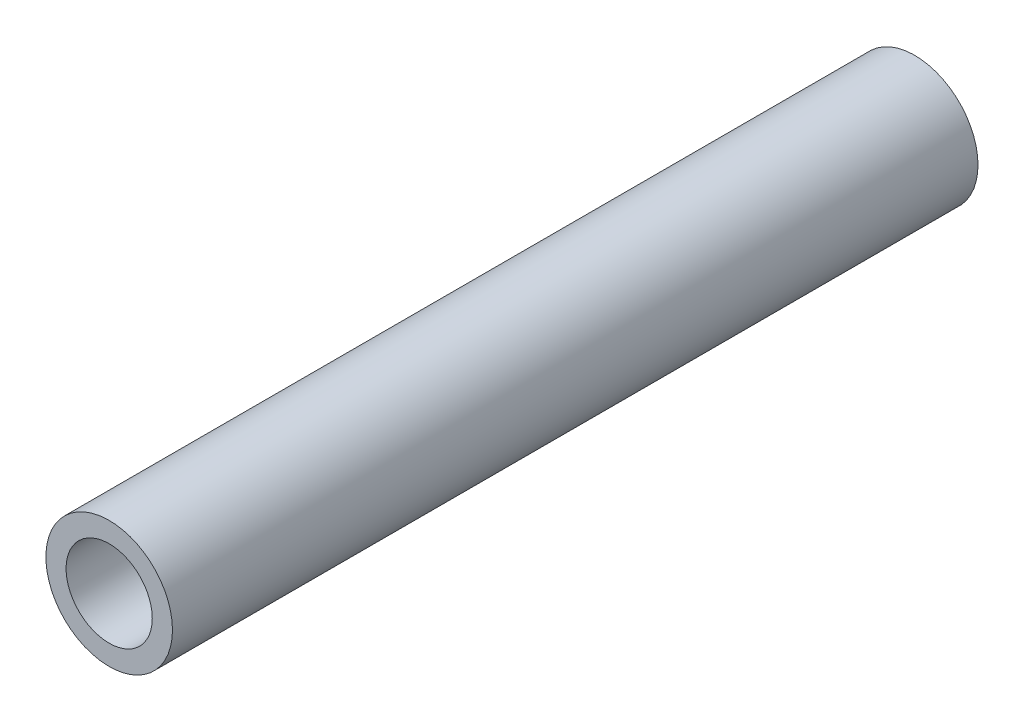
ISO-10303-21;
HEADER;
FILE_DESCRIPTION(('STEP AP214'),'2;1');
FILE_NAME('part.step','',(''),(''),'','','');
FILE_SCHEMA(('AUTOMOTIVE_DESIGN { 1 0 10303 214 1 1 1 1 }'));
ENDSEC;
DATA;
#1=APPLICATION_CONTEXT('core data for automotive mechanical design processes');
#2=APPLICATION_PROTOCOL_DEFINITION('international standard','automotive_design',2000,#1);
#3=PRODUCT_CONTEXT('',#1,'mechanical');
#4=PRODUCT('Part','Part','',(#3));
#5=PRODUCT_RELATED_PRODUCT_CATEGORY('part','',(#4));
#6=PRODUCT_DEFINITION_FORMATION('','',#4);
#7=PRODUCT_DEFINITION_CONTEXT('part definition',#1,'design');
#8=PRODUCT_DEFINITION('design','',#6,#7);
#9=PRODUCT_DEFINITION_SHAPE('','',#8);
#10=(LENGTH_UNIT() NAMED_UNIT(*) SI_UNIT(.MILLI.,.METRE.));
#11=(NAMED_UNIT(*) PLANE_ANGLE_UNIT() SI_UNIT($,.RADIAN.));
#12=(NAMED_UNIT(*) SI_UNIT($,.STERADIAN.) SOLID_ANGLE_UNIT());
#13=UNCERTAINTY_MEASURE_WITH_UNIT(LENGTH_MEASURE(1.E-05),#10,'distance_accuracy_value','');
#14=(GEOMETRIC_REPRESENTATION_CONTEXT(3) GLOBAL_UNCERTAINTY_ASSIGNED_CONTEXT((#13)) GLOBAL_UNIT_ASSIGNED_CONTEXT((#10,
#11,#12)) REPRESENTATION_CONTEXT('',''));
#15=CARTESIAN_POINT('',(0.,0.,0.));
#16=DIRECTION('',(0.,0.,1.));
#17=DIRECTION('',(1.,0.,0.));
#18=AXIS2_PLACEMENT_3D('',#15,#16,#17);
#19=CARTESIAN_POINT('',(164.150000000002,2168.81000620157,-40.));
#20=DIRECTION('',(0.,0.,1.));
#21=DIRECTION('',(1.,0.,0.));
#22=AXIS2_PLACEMENT_3D('',#19,#20,#21);
#23=CYLINDRICAL_SURFACE('',#22,10.9999999999994);
#24=CARTESIAN_POINT('',(164.150000000002,2168.81000620157,-40.));
#25=DIRECTION('',(0.,0.,1.));
#26=DIRECTION('',(1.,0.,0.));
#27=AXIS2_PLACEMENT_3D('',#24,#25,#26);
#28=CIRCLE('',#27,10.9999999999994);
#29=CARTESIAN_POINT('',(175.150000000001,2168.81000620157,-40.));
#30=VERTEX_POINT('',#29);
#31=EDGE_CURVE('E10',#30,#30,#28,.T.);
#32=CARTESIAN_POINT('',(164.150000000002,2168.81000620157,100.));
#33=DIRECTION('',(0.,0.,1.));
#34=DIRECTION('',(1.,0.,0.));
#35=AXIS2_PLACEMENT_3D('',#32,#33,#34);
#36=CIRCLE('',#35,10.9999999999994);
#37=CARTESIAN_POINT('',(175.150000000001,2168.81000620157,100.));
#38=VERTEX_POINT('',#37);
#39=EDGE_CURVE('E45',#38,#38,#36,.T.);
#40=CARTESIAN_POINT('',(175.150000000001,2168.81000620157,-40.));
#41=CARTESIAN_POINT('',(175.150000000001,2168.81000620157,-38.5416666666667));
#42=CARTESIAN_POINT('',(175.150000000001,2168.81000620157,-37.0833333333333));
#43=CARTESIAN_POINT('',(175.150000000001,2168.81000620157,-34.1666666666667));
#44=CARTESIAN_POINT('',(175.150000000001,2168.81000620157,-32.7083333333333));
#45=CARTESIAN_POINT('',(175.150000000001,2168.81000620157,-29.7916666666667));
#46=CARTESIAN_POINT('',(175.150000000001,2168.81000620157,-28.3333333333333));
#47=CARTESIAN_POINT('',(175.150000000001,2168.81000620157,-25.4166666666667));
#48=CARTESIAN_POINT('',(175.150000000001,2168.81000620157,-23.9583333333333));
#49=CARTESIAN_POINT('',(175.150000000001,2168.81000620157,-21.0416666666667));
#50=CARTESIAN_POINT('',(175.150000000001,2168.81000620157,-19.5833333333333));
#51=CARTESIAN_POINT('',(175.150000000001,2168.81000620157,-16.6666666666667));
#52=CARTESIAN_POINT('',(175.150000000001,2168.81000620157,-15.2083333333333));
#53=CARTESIAN_POINT('',(175.150000000001,2168.81000620157,-12.2916666666667));
#54=CARTESIAN_POINT('',(175.150000000001,2168.81000620157,-10.8333333333333));
#55=CARTESIAN_POINT('',(175.150000000001,2168.81000620157,-7.91666666666668));
#56=CARTESIAN_POINT('',(175.150000000001,2168.81000620157,-6.45833333333334));
#57=CARTESIAN_POINT('',(175.150000000001,2168.81000620157,-3.54166666666668));
#58=CARTESIAN_POINT('',(175.150000000001,2168.81000620157,-2.08333333333334));
#59=CARTESIAN_POINT('',(175.150000000001,2168.81000620157,0.833333333333327));
#60=CARTESIAN_POINT('',(175.150000000001,2168.81000620157,2.29166666666666));
#61=CARTESIAN_POINT('',(175.150000000001,2168.81000620157,5.20833333333333));
#62=CARTESIAN_POINT('',(175.150000000001,2168.81000620157,6.66666666666666));
#63=CARTESIAN_POINT('',(175.150000000001,2168.81000620157,9.58333333333333));
#64=CARTESIAN_POINT('',(175.150000000001,2168.81000620157,11.0416666666667));
#65=CARTESIAN_POINT('',(175.150000000001,2168.81000620157,13.9583333333333));
#66=CARTESIAN_POINT('',(175.150000000001,2168.81000620157,15.4166666666667));
#67=CARTESIAN_POINT('',(175.150000000001,2168.81000620157,18.3333333333333));
#68=CARTESIAN_POINT('',(175.150000000001,2168.81000620157,19.7916666666667));
#69=CARTESIAN_POINT('',(175.150000000001,2168.81000620157,22.7083333333333));
#70=CARTESIAN_POINT('',(175.150000000001,2168.81000620157,24.1666666666667));
#71=CARTESIAN_POINT('',(175.150000000001,2168.81000620157,27.0833333333333));
#72=CARTESIAN_POINT('',(175.150000000001,2168.81000620157,28.5416666666667));
#73=CARTESIAN_POINT('',(175.150000000001,2168.81000620157,31.4583333333333));
#74=CARTESIAN_POINT('',(175.150000000001,2168.81000620157,32.9166666666667));
#75=CARTESIAN_POINT('',(175.150000000001,2168.81000620157,35.8333333333333));
#76=CARTESIAN_POINT('',(175.150000000001,2168.81000620157,37.2916666666667));
#77=CARTESIAN_POINT('',(175.150000000001,2168.81000620157,40.2083333333333));
#78=CARTESIAN_POINT('',(175.150000000001,2168.81000620157,41.6666666666667));
#79=CARTESIAN_POINT('',(175.150000000001,2168.81000620157,44.5833333333333));
#80=CARTESIAN_POINT('',(175.150000000001,2168.81000620157,46.0416666666667));
#81=CARTESIAN_POINT('',(175.150000000001,2168.81000620157,48.9583333333334));
#82=CARTESIAN_POINT('',(175.150000000001,2168.81000620157,50.4166666666667));
#83=CARTESIAN_POINT('',(175.150000000001,2168.81000620157,53.3333333333333));
#84=CARTESIAN_POINT('',(175.150000000001,2168.81000620157,54.7916666666667));
#85=CARTESIAN_POINT('',(175.150000000001,2168.81000620157,57.7083333333333));
#86=CARTESIAN_POINT('',(175.150000000001,2168.81000620157,59.1666666666667));
#87=CARTESIAN_POINT('',(175.150000000001,2168.81000620157,62.0833333333334));
#88=CARTESIAN_POINT('',(175.150000000001,2168.81000620157,63.5416666666667));
#89=CARTESIAN_POINT('',(175.150000000001,2168.81000620157,66.4583333333334));
#90=CARTESIAN_POINT('',(175.150000000001,2168.81000620157,67.9166666666667));
#91=CARTESIAN_POINT('',(175.150000000001,2168.81000620157,70.8333333333334));
#92=CARTESIAN_POINT('',(175.150000000001,2168.81000620157,72.2916666666667));
#93=CARTESIAN_POINT('',(175.150000000001,2168.81000620157,75.2083333333334));
#94=CARTESIAN_POINT('',(175.150000000001,2168.81000620157,76.6666666666667));
#95=CARTESIAN_POINT('',(175.150000000001,2168.81000620157,79.5833333333334));
#96=CARTESIAN_POINT('',(175.150000000001,2168.81000620157,81.0416666666667));
#97=CARTESIAN_POINT('',(175.150000000001,2168.81000620157,83.9583333333334));
#98=CARTESIAN_POINT('',(175.150000000001,2168.81000620157,85.4166666666667));
#99=CARTESIAN_POINT('',(175.150000000001,2168.81000620157,88.3333333333334));
#100=CARTESIAN_POINT('',(175.150000000001,2168.81000620157,89.7916666666667));
#101=CARTESIAN_POINT('',(175.150000000001,2168.81000620157,92.7083333333334));
#102=CARTESIAN_POINT('',(175.150000000001,2168.81000620157,94.1666666666667));
#103=CARTESIAN_POINT('',(175.150000000001,2168.81000620157,97.0833333333334));
#104=CARTESIAN_POINT('',(175.150000000001,2168.81000620157,98.5416666666667));
#105=CARTESIAN_POINT('',(175.150000000001,2168.81000620157,100.));
#106=B_SPLINE_CURVE_WITH_KNOTS('',3,(#40,#41,#42,#43,#44,#45,#46,#47,#48,#49,#50,#51,#52,#53,
#54,#55,#56,#57,#58,#59,#60,#61,#62,#63,#64,#65,#66,#67,#68,#69,#70,#71,#72,#73,#74,#75,#76,#77,
#78,#79,#80,#81,#82,#83,#84,#85,#86,#87,#88,#89,#90,#91,#92,#93,#94,#95,#96,#97,#98,#99,#100,
#101,#102,#103,#104,#105),.UNSPECIFIED.,.F.,.F.,(4,2,2,2,2,2,2,2,2,2,2,2,2,2,2,2,2,2,2,2,2,2,2,
2,2,2,2,2,2,2,2,2,4),(0.,4.375,8.75000000000001,13.125,17.5,21.875,26.25,30.625,35.,39.375,
43.75,48.125,52.5,56.875,61.25,65.625,70.,74.375,78.75,83.125,87.5,91.875,96.25,100.625,105.,
109.375,113.75,118.125,122.5,126.875,131.25,135.625,140.),.UNSPECIFIED.);
#107=EDGE_CURVE('BSEAM35',#30,#38,#106,.T.);
#108=ORIENTED_EDGE('',*,*,#31,.T.);
#109=ORIENTED_EDGE('',*,*,#39,.F.);
#110=ORIENTED_EDGE('',*,*,#107,.T.);
#111=ORIENTED_EDGE('',*,*,#107,.F.);
#112=EDGE_LOOP('',(#108,#110,#109,#111));
#113=FACE_BOUND('',#112,.T.);
#114=ADVANCED_FACE('F35',(#113),#23,.T.);
#115=CARTESIAN_POINT('',(164.150000000002,2168.81000620157,-40.));
#116=DIRECTION('',(0.,0.,1.));
#117=DIRECTION('',(1.,0.,0.));
#118=AXIS2_PLACEMENT_3D('',#115,#116,#117);
#119=PLANE('',#118);
#120=CARTESIAN_POINT('',(164.150000000002,2168.81000620157,-40.));
#121=DIRECTION('',(0.,0.,1.));
#122=DIRECTION('',(1.,0.,0.));
#123=AXIS2_PLACEMENT_3D('',#120,#121,#122);
#124=CIRCLE('',#123,7.49);
#125=CARTESIAN_POINT('',(171.640000000002,2168.81000620157,-40.));
#126=VERTEX_POINT('',#125);
#127=EDGE_CURVE('E41',#126,#126,#124,.T.);
#128=ORIENTED_EDGE('',*,*,#127,.T.);
#129=EDGE_LOOP('',(#128));
#130=FACE_BOUND('',#129,.T.);
#131=ORIENTED_EDGE('',*,*,#31,.F.);
#132=EDGE_LOOP('',(#131));
#133=FACE_BOUND('',#132,.T.);
#134=ADVANCED_FACE('F64',(#130,#133),#119,.F.);
#135=CARTESIAN_POINT('',(164.150000000002,2168.81000620157,-40.));
#136=DIRECTION('',(0.,0.,1.));
#137=DIRECTION('',(1.,0.,0.));
#138=AXIS2_PLACEMENT_3D('',#135,#136,#137);
#139=CYLINDRICAL_SURFACE('',#138,7.49);
#140=CARTESIAN_POINT('',(164.150000000002,2168.81000620157,100.));
#141=DIRECTION('',(0.,0.,1.));
#142=DIRECTION('',(1.,0.,0.));
#143=AXIS2_PLACEMENT_3D('',#140,#141,#142);
#144=CIRCLE('',#143,7.49);
#145=CARTESIAN_POINT('',(171.640000000002,2168.81000620157,100.));
#146=VERTEX_POINT('',#145);
#147=EDGE_CURVE('E49',#146,#146,#144,.T.);
#148=CARTESIAN_POINT('',(171.640000000002,2168.81000620157,-40.));
#149=CARTESIAN_POINT('',(171.640000000002,2168.81000620157,-38.5416666666667));
#150=CARTESIAN_POINT('',(171.640000000002,2168.81000620157,-37.0833333333333));
#151=CARTESIAN_POINT('',(171.640000000002,2168.81000620157,-34.1666666666667));
#152=CARTESIAN_POINT('',(171.640000000002,2168.81000620157,-32.7083333333333));
#153=CARTESIAN_POINT('',(171.640000000002,2168.81000620157,-29.7916666666667));
#154=CARTESIAN_POINT('',(171.640000000002,2168.81000620157,-28.3333333333333));
#155=CARTESIAN_POINT('',(171.640000000002,2168.81000620157,-25.4166666666667));
#156=CARTESIAN_POINT('',(171.640000000002,2168.81000620157,-23.9583333333333));
#157=CARTESIAN_POINT('',(171.640000000002,2168.81000620157,-21.0416666666667));
#158=CARTESIAN_POINT('',(171.640000000002,2168.81000620157,-19.5833333333333));
#159=CARTESIAN_POINT('',(171.640000000002,2168.81000620157,-16.6666666666667));
#160=CARTESIAN_POINT('',(171.640000000002,2168.81000620157,-15.2083333333333));
#161=CARTESIAN_POINT('',(171.640000000002,2168.81000620157,-12.2916666666667));
#162=CARTESIAN_POINT('',(171.640000000002,2168.81000620157,-10.8333333333333));
#163=CARTESIAN_POINT('',(171.640000000002,2168.81000620157,-7.91666666666667));
#164=CARTESIAN_POINT('',(171.640000000002,2168.81000620157,-6.45833333333334));
#165=CARTESIAN_POINT('',(171.640000000002,2168.81000620157,-3.54166666666667));
#166=CARTESIAN_POINT('',(171.640000000002,2168.81000620157,-2.08333333333334));
#167=CARTESIAN_POINT('',(171.640000000002,2168.81000620157,0.833333333333334));
#168=CARTESIAN_POINT('',(171.640000000002,2168.81000620157,2.29166666666667));
#169=CARTESIAN_POINT('',(171.640000000002,2168.81000620157,5.20833333333334));
#170=CARTESIAN_POINT('',(171.640000000002,2168.81000620157,6.66666666666667));
#171=CARTESIAN_POINT('',(171.640000000002,2168.81000620157,9.58333333333333));
#172=CARTESIAN_POINT('',(171.640000000002,2168.81000620157,11.0416666666667));
#173=CARTESIAN_POINT('',(171.640000000002,2168.81000620157,13.9583333333333));
#174=CARTESIAN_POINT('',(171.640000000002,2168.81000620157,15.4166666666667));
#175=CARTESIAN_POINT('',(171.640000000002,2168.81000620157,18.3333333333333));
#176=CARTESIAN_POINT('',(171.640000000002,2168.81000620157,19.7916666666667));
#177=CARTESIAN_POINT('',(171.640000000002,2168.81000620157,22.7083333333333));
#178=CARTESIAN_POINT('',(171.640000000002,2168.81000620157,24.1666666666667));
#179=CARTESIAN_POINT('',(171.640000000002,2168.81000620157,27.0833333333333));
#180=CARTESIAN_POINT('',(171.640000000002,2168.81000620157,28.5416666666667));
#181=CARTESIAN_POINT('',(171.640000000002,2168.81000620157,31.4583333333333));
#182=CARTESIAN_POINT('',(171.640000000002,2168.81000620157,32.9166666666667));
#183=CARTESIAN_POINT('',(171.640000000002,2168.81000620157,35.8333333333333));
#184=CARTESIAN_POINT('',(171.640000000002,2168.81000620157,37.2916666666667));
#185=CARTESIAN_POINT('',(171.640000000002,2168.81000620157,40.2083333333333));
#186=CARTESIAN_POINT('',(171.640000000002,2168.81000620157,41.6666666666667));
#187=CARTESIAN_POINT('',(171.640000000002,2168.81000620157,44.5833333333333));
#188=CARTESIAN_POINT('',(171.640000000002,2168.81000620157,46.0416666666667));
#189=CARTESIAN_POINT('',(171.640000000002,2168.81000620157,48.9583333333334));
#190=CARTESIAN_POINT('',(171.640000000002,2168.81000620157,50.4166666666667));
#191=CARTESIAN_POINT('',(171.640000000002,2168.81000620157,53.3333333333333));
#192=CARTESIAN_POINT('',(171.640000000002,2168.81000620157,54.7916666666667));
#193=CARTESIAN_POINT('',(171.640000000002,2168.81000620157,57.7083333333333));
#194=CARTESIAN_POINT('',(171.640000000002,2168.81000620157,59.1666666666667));
#195=CARTESIAN_POINT('',(171.640000000002,2168.81000620157,62.0833333333334));
#196=CARTESIAN_POINT('',(171.640000000002,2168.81000620157,63.5416666666667));
#197=CARTESIAN_POINT('',(171.640000000002,2168.81000620157,66.4583333333334));
#198=CARTESIAN_POINT('',(171.640000000002,2168.81000620157,67.9166666666667));
#199=CARTESIAN_POINT('',(171.640000000002,2168.81000620157,70.8333333333334));
#200=CARTESIAN_POINT('',(171.640000000002,2168.81000620157,72.2916666666667));
#201=CARTESIAN_POINT('',(171.640000000002,2168.81000620157,75.2083333333334));
#202=CARTESIAN_POINT('',(171.640000000002,2168.81000620157,76.6666666666667));
#203=CARTESIAN_POINT('',(171.640000000002,2168.81000620157,79.5833333333334));
#204=CARTESIAN_POINT('',(171.640000000002,2168.81000620157,81.0416666666667));
#205=CARTESIAN_POINT('',(171.640000000002,2168.81000620157,83.9583333333334));
#206=CARTESIAN_POINT('',(171.640000000002,2168.81000620157,85.4166666666667));
#207=CARTESIAN_POINT('',(171.640000000002,2168.81000620157,88.3333333333334));
#208=CARTESIAN_POINT('',(171.640000000002,2168.81000620157,89.7916666666667));
#209=CARTESIAN_POINT('',(171.640000000002,2168.81000620157,92.7083333333334));
#210=CARTESIAN_POINT('',(171.640000000002,2168.81000620157,94.1666666666667));
#211=CARTESIAN_POINT('',(171.640000000002,2168.81000620157,97.0833333333334));
#212=CARTESIAN_POINT('',(171.640000000002,2168.81000620157,98.5416666666667));
#213=CARTESIAN_POINT('',(171.640000000002,2168.81000620157,100.));
#214=B_SPLINE_CURVE_WITH_KNOTS('',3,(#148,#149,#150,#151,#152,#153,#154,#155,#156,#157,#158,
#159,#160,#161,#162,#163,#164,#165,#166,#167,#168,#169,#170,#171,#172,#173,#174,#175,#176,#177,
#178,#179,#180,#181,#182,#183,#184,#185,#186,#187,#188,#189,#190,#191,#192,#193,#194,#195,#196,
#197,#198,#199,#200,#201,#202,#203,#204,#205,#206,#207,#208,#209,#210,#211,#212,#213),
.UNSPECIFIED.,.F.,.F.,(4,2,2,2,2,2,2,2,2,2,2,2,2,2,2,2,2,2,2,2,2,2,2,2,2,2,2,2,2,2,2,2,4),(0.,
4.375,8.75,13.125,17.5,21.875,26.25,30.625,35.,39.375,43.75,48.125,52.5,56.875,61.25,65.625,70.,
74.375,78.75,83.125,87.5,91.875,96.25,100.625,105.,109.375,113.75,118.125,122.5,126.875,131.25,
135.625,140.),.UNSPECIFIED.);
#215=EDGE_CURVE('BSEAM55',#126,#146,#214,.T.);
#216=ORIENTED_EDGE('',*,*,#127,.F.);
#217=ORIENTED_EDGE('',*,*,#147,.T.);
#218=ORIENTED_EDGE('',*,*,#215,.T.);
#219=ORIENTED_EDGE('',*,*,#215,.F.);
#220=EDGE_LOOP('',(#216,#218,#217,#219));
#221=FACE_BOUND('',#220,.T.);
#222=ADVANCED_FACE('F55',(#221),#139,.F.);
#223=CARTESIAN_POINT('',(164.150000000002,2168.81000620157,100.));
#224=DIRECTION('',(0.,0.,1.));
#225=DIRECTION('',(1.,0.,0.));
#226=AXIS2_PLACEMENT_3D('',#223,#224,#225);
#227=PLANE('',#226);
#228=ORIENTED_EDGE('',*,*,#39,.T.);
#229=EDGE_LOOP('',(#228));
#230=FACE_BOUND('',#229,.T.);
#231=ORIENTED_EDGE('',*,*,#147,.F.);
#232=EDGE_LOOP('',(#231));
#233=FACE_BOUND('',#232,.T.);
#234=ADVANCED_FACE('F57',(#230,#233),#227,.T.);
#235=CLOSED_SHELL('',(#114,#134,#222,#234));
#236=MANIFOLD_SOLID_BREP('B2',#235);
#237=ADVANCED_BREP_SHAPE_REPRESENTATION('',(#18,#236),#14);
#238=SHAPE_DEFINITION_REPRESENTATION(#9,#237);
ENDSEC;
END-ISO-10303-21;
